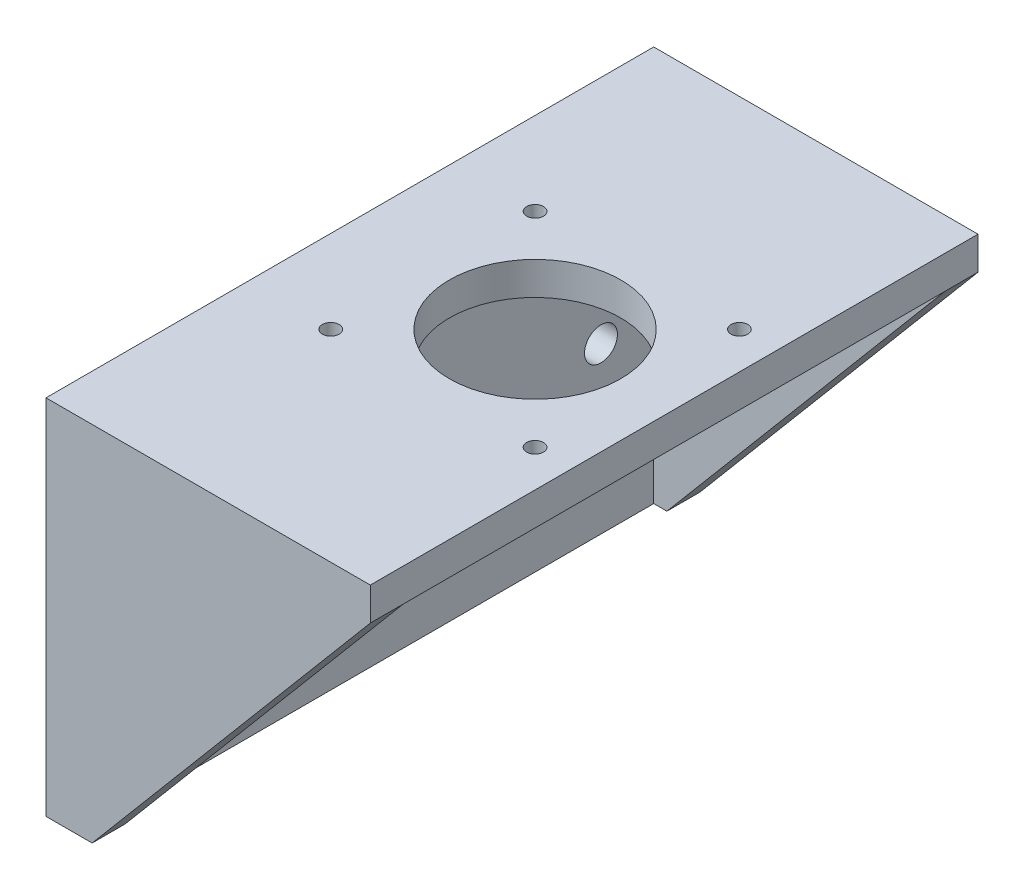
ISO-10303-21;
HEADER;
FILE_DESCRIPTION(('STEP AP214'),'2;1');
FILE_NAME('part.step','',(''),(''),'','','');
FILE_SCHEMA(('AUTOMOTIVE_DESIGN { 1 0 10303 214 1 1 1 1 }'));
ENDSEC;
DATA;
#1=APPLICATION_CONTEXT('core data for automotive mechanical design processes');
#2=APPLICATION_PROTOCOL_DEFINITION('international standard','automotive_design',2000,#1);
#3=PRODUCT_CONTEXT('',#1,'mechanical');
#4=PRODUCT('Part','Part','',(#3));
#5=PRODUCT_RELATED_PRODUCT_CATEGORY('part','',(#4));
#6=PRODUCT_DEFINITION_FORMATION('','',#4);
#7=PRODUCT_DEFINITION_CONTEXT('part definition',#1,'design');
#8=PRODUCT_DEFINITION('design','',#6,#7);
#9=PRODUCT_DEFINITION_SHAPE('','',#8);
#10=(LENGTH_UNIT() NAMED_UNIT(*) SI_UNIT(.MILLI.,.METRE.));
#11=(NAMED_UNIT(*) PLANE_ANGLE_UNIT() SI_UNIT($,.RADIAN.));
#12=(NAMED_UNIT(*) SI_UNIT($,.STERADIAN.) SOLID_ANGLE_UNIT());
#13=UNCERTAINTY_MEASURE_WITH_UNIT(LENGTH_MEASURE(1.E-05),#10,'distance_accuracy_value','');
#14=(GEOMETRIC_REPRESENTATION_CONTEXT(3) GLOBAL_UNCERTAINTY_ASSIGNED_CONTEXT((#13)) GLOBAL_UNIT_ASSIGNED_CONTEXT((#10,
#11,#12)) REPRESENTATION_CONTEXT('',''));
#15=CARTESIAN_POINT('',(0.,0.,0.));
#16=DIRECTION('',(0.,0.,1.));
#17=DIRECTION('',(1.,0.,0.));
#18=AXIS2_PLACEMENT_3D('',#15,#16,#17);
#19=CARTESIAN_POINT('',(-28.1,-25.0000000000001,-33.1000000000001));
#20=DIRECTION('',(1.,0.,0.));
#21=DIRECTION('',(0.,0.,-1.));
#22=AXIS2_PLACEMENT_3D('',#19,#20,#21);
#23=CYLINDRICAL_SURFACE('',#22,2.5);
#24=CARTESIAN_POINT('',(-28.1,-25.0000000000001,-33.1000000000001));
#25=DIRECTION('',(-1.,0.,0.));
#26=DIRECTION('',(0.,0.,1.));
#27=AXIS2_PLACEMENT_3D('',#24,#25,#26);
#28=CIRCLE('',#27,2.5);
#29=CARTESIAN_POINT('',(-28.1,-25.0000000000001,-30.6000000000001));
#30=VERTEX_POINT('',#29);
#31=EDGE_CURVE('E159',#30,#30,#28,.T.);
#32=ORIENTED_EDGE('',*,*,#31,.T.);
#33=EDGE_LOOP('',(#32));
#34=FACE_BOUND('',#33,.T.);
#35=CARTESIAN_POINT('',(-23.1,-25.0000000000001,-33.1000000000001));
#36=DIRECTION('',(1.,0.,0.));
#37=DIRECTION('',(0.,0.,-1.));
#38=AXIS2_PLACEMENT_3D('',#35,#36,#37);
#39=CIRCLE('',#38,2.5);
#40=CARTESIAN_POINT('',(-23.1,-25.0000000000001,-35.6000000000001));
#41=VERTEX_POINT('',#40);
#42=EDGE_CURVE('E143',#41,#41,#39,.T.);
#43=ORIENTED_EDGE('',*,*,#42,.T.);
#44=EDGE_LOOP('',(#43));
#45=FACE_BOUND('',#44,.T.);
#46=ADVANCED_FACE('F45',(#34,#45),#23,.F.);
#47=CARTESIAN_POINT('',(-28.1,-25.,33.1));
#48=DIRECTION('',(1.,0.,0.));
#49=DIRECTION('',(0.,0.,-1.));
#50=AXIS2_PLACEMENT_3D('',#47,#48,#49);
#51=CYLINDRICAL_SURFACE('',#50,2.5);
#52=CARTESIAN_POINT('',(-28.1,-25.,33.1));
#53=DIRECTION('',(1.,0.,0.));
#54=DIRECTION('',(0.,0.,-1.));
#55=AXIS2_PLACEMENT_3D('',#52,#53,#54);
#56=CIRCLE('',#55,2.5);
#57=CARTESIAN_POINT('',(-28.1,-25.,30.6));
#58=VERTEX_POINT('',#57);
#59=EDGE_CURVE('E162',#58,#58,#56,.T.);
#60=ORIENTED_EDGE('',*,*,#59,.F.);
#61=EDGE_LOOP('',(#60));
#62=FACE_BOUND('',#61,.T.);
#63=CARTESIAN_POINT('',(-23.1,-25.,33.1));
#64=DIRECTION('',(1.,0.,0.));
#65=DIRECTION('',(0.,0.,-1.));
#66=AXIS2_PLACEMENT_3D('',#63,#64,#65);
#67=CIRCLE('',#66,2.5);
#68=CARTESIAN_POINT('',(-23.1,-25.,30.6));
#69=VERTEX_POINT('',#68);
#70=EDGE_CURVE('E147',#69,#69,#67,.T.);
#71=ORIENTED_EDGE('',*,*,#70,.T.);
#72=EDGE_LOOP('',(#71));
#73=FACE_BOUND('',#72,.T.);
#74=ADVANCED_FACE('F299',(#62,#73),#51,.F.);
#75=CARTESIAN_POINT('',(-28.1,5.,0.));
#76=DIRECTION('',(1.,0.,0.));
#77=DIRECTION('',(0.,0.,-1.));
#78=AXIS2_PLACEMENT_3D('',#75,#76,#77);
#79=PLANE('',#78);
#80=DIRECTION('',(0.,-1.,0.));
#81=VECTOR('',#80,1.);
#82=CARTESIAN_POINT('',(-28.1,5.,-46.1));
#83=LINE('',#82,#81);
#84=CARTESIAN_POINT('',(-28.1,5.,-46.1));
#85=VERTEX_POINT('',#84);
#86=CARTESIAN_POINT('',(-28.1,-50.,-46.1));
#87=VERTEX_POINT('',#86);
#88=EDGE_CURVE('E261',#85,#87,#83,.T.);
#89=ORIENTED_EDGE('',*,*,#88,.T.);
#90=DIRECTION('',(0.,0.,1.));
#91=VECTOR('',#90,1.);
#92=CARTESIAN_POINT('',(-28.1,-50.,0.));
#93=LINE('',#92,#91);
#94=CARTESIAN_POINT('',(-28.1,-50.,46.1));
#95=VERTEX_POINT('',#94);
#96=EDGE_CURVE('E191',#87,#95,#93,.T.);
#97=ORIENTED_EDGE('',*,*,#96,.T.);
#98=DIRECTION('',(0.,-1.,0.));
#99=VECTOR('',#98,1.);
#100=CARTESIAN_POINT('',(-28.1,5.,46.1));
#101=LINE('',#100,#99);
#102=CARTESIAN_POINT('',(-28.1,5.,46.1));
#103=VERTEX_POINT('',#102);
#104=EDGE_CURVE('E236',#103,#95,#101,.T.);
#105=ORIENTED_EDGE('',*,*,#104,.F.);
#106=DIRECTION('',(0.,0.,1.));
#107=VECTOR('',#106,1.);
#108=CARTESIAN_POINT('',(-28.1,5.,0.));
#109=LINE('',#108,#107);
#110=EDGE_CURVE('E213',#85,#103,#109,.T.);
#111=ORIENTED_EDGE('',*,*,#110,.F.);
#112=EDGE_LOOP('',(#89,#97,#105,#111));
#113=FACE_BOUND('',#112,.T.);
#114=ORIENTED_EDGE('',*,*,#31,.F.);
#115=EDGE_LOOP('',(#114));
#116=FACE_BOUND('',#115,.T.);
#117=ORIENTED_EDGE('',*,*,#59,.T.);
#118=EDGE_LOOP('',(#117));
#119=FACE_BOUND('',#118,.T.);
#120=ADVANCED_FACE('F296',(#113,#116,#119),#79,.F.);
#121=CARTESIAN_POINT('',(0.,0.,0.));
#122=DIRECTION('',(0.,1.,0.));
#123=DIRECTION('',(0.,0.,1.));
#124=AXIS2_PLACEMENT_3D('',#121,#122,#123);
#125=PLANE('',#124);
#126=CARTESIAN_POINT('',(15.5,0.,15.5));
#127=DIRECTION('',(0.,1.,0.));
#128=DIRECTION('',(0.,0.,1.));
#129=AXIS2_PLACEMENT_3D('',#126,#127,#128);
#130=CIRCLE('',#129,1.275);
#131=CARTESIAN_POINT('',(15.5,0.,16.775));
#132=VERTEX_POINT('',#131);
#133=EDGE_CURVE('E206',#132,#132,#130,.T.);
#134=ORIENTED_EDGE('',*,*,#133,.T.);
#135=EDGE_LOOP('',(#134));
#136=FACE_BOUND('',#135,.T.);
#137=CARTESIAN_POINT('',(-15.5,0.,15.5));
#138=DIRECTION('',(0.,1.,0.));
#139=DIRECTION('',(0.,0.,1.));
#140=AXIS2_PLACEMENT_3D('',#137,#138,#139);
#141=CIRCLE('',#140,1.275);
#142=CARTESIAN_POINT('',(-15.5,0.,16.775));
#143=VERTEX_POINT('',#142);
#144=EDGE_CURVE('E251',#143,#143,#141,.T.);
#145=ORIENTED_EDGE('',*,*,#144,.T.);
#146=EDGE_LOOP('',(#145));
#147=FACE_BOUND('',#146,.T.);
#148=CARTESIAN_POINT('',(15.5,0.,-15.5));
#149=DIRECTION('',(0.,1.,0.));
#150=DIRECTION('',(0.,0.,1.));
#151=AXIS2_PLACEMENT_3D('',#148,#149,#150);
#152=CIRCLE('',#151,1.275);
#153=CARTESIAN_POINT('',(15.5,0.,-14.225));
#154=VERTEX_POINT('',#153);
#155=EDGE_CURVE('E247',#154,#154,#152,.T.);
#156=ORIENTED_EDGE('',*,*,#155,.T.);
#157=EDGE_LOOP('',(#156));
#158=FACE_BOUND('',#157,.T.);
#159=CARTESIAN_POINT('',(-15.5,0.,-15.5));
#160=DIRECTION('',(0.,1.,0.));
#161=DIRECTION('',(0.,0.,1.));
#162=AXIS2_PLACEMENT_3D('',#159,#160,#161);
#163=CIRCLE('',#162,1.275);
#164=CARTESIAN_POINT('',(-15.5,0.,-14.225));
#165=VERTEX_POINT('',#164);
#166=EDGE_CURVE('E243',#165,#165,#163,.T.);
#167=ORIENTED_EDGE('',*,*,#166,.T.);
#168=EDGE_LOOP('',(#167));
#169=FACE_BOUND('',#168,.T.);
#170=CARTESIAN_POINT('',(0.,0.,0.));
#171=DIRECTION('',(0.,1.,0.));
#172=DIRECTION('',(0.,0.,1.));
#173=AXIS2_PLACEMENT_3D('',#170,#171,#172);
#174=CIRCLE('',#173,13.);
#175=CARTESIAN_POINT('',(0.,0.,13.));
#176=VERTEX_POINT('',#175);
#177=EDGE_CURVE('E239',#176,#176,#174,.T.);
#178=ORIENTED_EDGE('',*,*,#177,.T.);
#179=EDGE_LOOP('',(#178));
#180=FACE_BOUND('',#179,.T.);
#181=DIRECTION('',(1.,0.,0.));
#182=VECTOR('',#181,1.);
#183=CARTESIAN_POINT('',(0.,0.,41.1));
#184=LINE('',#183,#182);
#185=CARTESIAN_POINT('',(-23.1,0.,41.1));
#186=VERTEX_POINT('',#185);
#187=CARTESIAN_POINT('',(21.1,0.,41.1));
#188=VERTEX_POINT('',#187);
#189=EDGE_CURVE('E131',#186,#188,#184,.T.);
#190=ORIENTED_EDGE('',*,*,#189,.F.);
#191=DIRECTION('',(0.,0.,1.));
#192=VECTOR('',#191,1.);
#193=CARTESIAN_POINT('',(-23.1,0.,-41.1));
#194=LINE('',#193,#192);
#195=CARTESIAN_POINT('',(-23.1,0.,-41.1));
#196=VERTEX_POINT('',#195);
#197=EDGE_CURVE('E133',#196,#186,#194,.T.);
#198=ORIENTED_EDGE('',*,*,#197,.F.);
#199=DIRECTION('',(1.,0.,0.));
#200=VECTOR('',#199,1.);
#201=CARTESIAN_POINT('',(0.,0.,-41.1));
#202=LINE('',#201,#200);
#203=CARTESIAN_POINT('',(21.1,0.,-41.1));
#204=VERTEX_POINT('',#203);
#205=EDGE_CURVE('E119',#196,#204,#202,.T.);
#206=ORIENTED_EDGE('',*,*,#205,.T.);
#207=DIRECTION('',(0.,0.,-1.));
#208=VECTOR('',#207,1.);
#209=CARTESIAN_POINT('',(21.1,0.,0.));
#210=LINE('',#209,#208);
#211=EDGE_CURVE('E198',#188,#204,#210,.T.);
#212=ORIENTED_EDGE('',*,*,#211,.F.);
#213=EDGE_LOOP('',(#190,#198,#206,#212));
#214=FACE_BOUND('',#213,.T.);
#215=ADVANCED_FACE('F134',(#136,#147,#158,#169,#180,#214),#125,.F.);
#216=CARTESIAN_POINT('',(0.,5.,46.1));
#217=DIRECTION('',(0.,0.,1.));
#218=DIRECTION('',(1.,0.,0.));
#219=AXIS2_PLACEMENT_3D('',#216,#217,#218);
#220=PLANE('',#219);
#221=DIRECTION('',(-0.644982532170896,-0.764197312998691,0.));
#222=VECTOR('',#221,1.);
#223=CARTESIAN_POINT('',(12.3223479504023,-10.4000616701395,46.1));
#224=LINE('',#223,#222);
#225=CARTESIAN_POINT('',(21.1,0.,46.1));
#226=VERTEX_POINT('',#225);
#227=CARTESIAN_POINT('',(-21.1,-50.,46.1));
#228=VERTEX_POINT('',#227);
#229=EDGE_CURVE('E69',#226,#228,#224,.T.);
#230=ORIENTED_EDGE('',*,*,#229,.F.);
#231=DIRECTION('',(0.,-1.,0.));
#232=VECTOR('',#231,1.);
#233=CARTESIAN_POINT('',(21.1,5.,46.1));
#234=LINE('',#233,#232);
#235=CARTESIAN_POINT('',(21.1,5.,46.1));
#236=VERTEX_POINT('',#235);
#237=EDGE_CURVE('E54',#236,#226,#234,.T.);
#238=ORIENTED_EDGE('',*,*,#237,.F.);
#239=DIRECTION('',(-1.,0.,0.));
#240=VECTOR('',#239,1.);
#241=CARTESIAN_POINT('',(0.,5.,46.1));
#242=LINE('',#241,#240);
#243=EDGE_CURVE('E201',#236,#103,#242,.T.);
#244=ORIENTED_EDGE('',*,*,#243,.T.);
#245=ORIENTED_EDGE('',*,*,#104,.T.);
#246=DIRECTION('',(-1.,0.,0.));
#247=VECTOR('',#246,1.);
#248=CARTESIAN_POINT('',(0.,-50.,46.1));
#249=LINE('',#248,#247);
#250=EDGE_CURVE('E195',#228,#95,#249,.T.);
#251=ORIENTED_EDGE('',*,*,#250,.F.);
#252=EDGE_LOOP('',(#230,#238,#244,#245,#251));
#253=FACE_BOUND('',#252,.T.);
#254=ADVANCED_FACE('F47',(#253),#220,.T.);
#255=CARTESIAN_POINT('',(21.1,5.,0.));
#256=DIRECTION('',(-1.,0.,0.));
#257=DIRECTION('',(0.,0.,1.));
#258=AXIS2_PLACEMENT_3D('',#255,#256,#257);
#259=PLANE('',#258);
#260=ORIENTED_EDGE('',*,*,#237,.T.);
#261=DIRECTION('',(0.,0.,1.));
#262=VECTOR('',#261,1.);
#263=CARTESIAN_POINT('',(21.1,0.,-46.1));
#264=LINE('',#263,#262);
#265=EDGE_CURVE('E173',#188,#226,#264,.T.);
#266=ORIENTED_EDGE('',*,*,#265,.F.);
#267=ORIENTED_EDGE('',*,*,#211,.T.);
#268=CARTESIAN_POINT('',(21.1,0.,-46.1));
#269=VERTEX_POINT('',#268);
#270=EDGE_CURVE('E181',#269,#204,#264,.T.);
#271=ORIENTED_EDGE('',*,*,#270,.F.);
#272=DIRECTION('',(0.,-1.,0.));
#273=VECTOR('',#272,1.);
#274=CARTESIAN_POINT('',(21.1,5.,-46.1));
#275=LINE('',#274,#273);
#276=CARTESIAN_POINT('',(21.1,5.,-46.1));
#277=VERTEX_POINT('',#276);
#278=EDGE_CURVE('E265',#277,#269,#275,.T.);
#279=ORIENTED_EDGE('',*,*,#278,.F.);
#280=DIRECTION('',(0.,0.,-1.));
#281=VECTOR('',#280,1.);
#282=CARTESIAN_POINT('',(21.1,5.,0.));
#283=LINE('',#282,#281);
#284=EDGE_CURVE('E205',#236,#277,#283,.T.);
#285=ORIENTED_EDGE('',*,*,#284,.F.);
#286=EDGE_LOOP('',(#260,#266,#267,#271,#279,#285));
#287=FACE_BOUND('',#286,.T.);
#288=ADVANCED_FACE('F273',(#287),#259,.F.);
#289=CARTESIAN_POINT('',(0.,5.,-46.1));
#290=DIRECTION('',(0.,0.,-1.));
#291=DIRECTION('',(-1.,0.,0.));
#292=AXIS2_PLACEMENT_3D('',#289,#290,#291);
#293=PLANE('',#292);
#294=DIRECTION('',(-0.644982532170896,-0.764197312998691,0.));
#295=VECTOR('',#294,1.);
#296=CARTESIAN_POINT('',(12.3223479504023,-10.4000616701395,-46.1));
#297=LINE('',#296,#295);
#298=CARTESIAN_POINT('',(-21.1,-50.,-46.1));
#299=VERTEX_POINT('',#298);
#300=EDGE_CURVE('E169',#269,#299,#297,.T.);
#301=ORIENTED_EDGE('',*,*,#300,.T.);
#302=DIRECTION('',(-1.,0.,0.));
#303=VECTOR('',#302,1.);
#304=CARTESIAN_POINT('',(0.,-50.,-46.1));
#305=LINE('',#304,#303);
#306=EDGE_CURVE('E130',#299,#87,#305,.T.);
#307=ORIENTED_EDGE('',*,*,#306,.T.);
#308=ORIENTED_EDGE('',*,*,#88,.F.);
#309=DIRECTION('',(1.,0.,0.));
#310=VECTOR('',#309,1.);
#311=CARTESIAN_POINT('',(0.,5.,-46.1));
#312=LINE('',#311,#310);
#313=EDGE_CURVE('E209',#85,#277,#312,.T.);
#314=ORIENTED_EDGE('',*,*,#313,.T.);
#315=ORIENTED_EDGE('',*,*,#278,.T.);
#316=EDGE_LOOP('',(#301,#307,#308,#314,#315));
#317=FACE_BOUND('',#316,.T.);
#318=ADVANCED_FACE('F289',(#317),#293,.T.);
#319=CARTESIAN_POINT('',(-15.5,5.,15.5));
#320=DIRECTION('',(0.,-1.,0.));
#321=DIRECTION('',(0.,0.,-1.));
#322=AXIS2_PLACEMENT_3D('',#319,#320,#321);
#323=CYLINDRICAL_SURFACE('',#322,1.275);
#324=CARTESIAN_POINT('',(-15.5,5.,15.5));
#325=DIRECTION('',(0.,1.,0.));
#326=DIRECTION('',(0.,0.,1.));
#327=AXIS2_PLACEMENT_3D('',#324,#325,#326);
#328=CIRCLE('',#327,1.275);
#329=CARTESIAN_POINT('',(-15.5,5.,16.775));
#330=VERTEX_POINT('',#329);
#331=EDGE_CURVE('E228',#330,#330,#328,.T.);
#332=ORIENTED_EDGE('',*,*,#331,.T.);
#333=EDGE_LOOP('',(#332));
#334=FACE_BOUND('',#333,.T.);
#335=ORIENTED_EDGE('',*,*,#144,.F.);
#336=EDGE_LOOP('',(#335));
#337=FACE_BOUND('',#336,.T.);
#338=ADVANCED_FACE('F342',(#334,#337),#323,.F.);
#339=CARTESIAN_POINT('',(15.5,5.,-15.5));
#340=DIRECTION('',(0.,-1.,0.));
#341=DIRECTION('',(0.,0.,-1.));
#342=AXIS2_PLACEMENT_3D('',#339,#340,#341);
#343=CYLINDRICAL_SURFACE('',#342,1.275);
#344=CARTESIAN_POINT('',(15.5,5.,-15.5));
#345=DIRECTION('',(0.,1.,0.));
#346=DIRECTION('',(0.,0.,1.));
#347=AXIS2_PLACEMENT_3D('',#344,#345,#346);
#348=CIRCLE('',#347,1.275);
#349=CARTESIAN_POINT('',(15.5,5.,-14.225));
#350=VERTEX_POINT('',#349);
#351=EDGE_CURVE('E224',#350,#350,#348,.T.);
#352=ORIENTED_EDGE('',*,*,#351,.T.);
#353=EDGE_LOOP('',(#352));
#354=FACE_BOUND('',#353,.T.);
#355=ORIENTED_EDGE('',*,*,#155,.F.);
#356=EDGE_LOOP('',(#355));
#357=FACE_BOUND('',#356,.T.);
#358=ADVANCED_FACE('F345',(#354,#357),#343,.F.);
#359=CARTESIAN_POINT('',(-15.5,5.,-15.5));
#360=DIRECTION('',(0.,-1.,0.));
#361=DIRECTION('',(0.,0.,-1.));
#362=AXIS2_PLACEMENT_3D('',#359,#360,#361);
#363=CYLINDRICAL_SURFACE('',#362,1.275);
#364=CARTESIAN_POINT('',(-15.5,5.,-15.5));
#365=DIRECTION('',(0.,1.,0.));
#366=DIRECTION('',(0.,0.,1.));
#367=AXIS2_PLACEMENT_3D('',#364,#365,#366);
#368=CIRCLE('',#367,1.275);
#369=CARTESIAN_POINT('',(-15.5,5.,-14.225));
#370=VERTEX_POINT('',#369);
#371=EDGE_CURVE('E220',#370,#370,#368,.T.);
#372=ORIENTED_EDGE('',*,*,#371,.T.);
#373=EDGE_LOOP('',(#372));
#374=FACE_BOUND('',#373,.T.);
#375=ORIENTED_EDGE('',*,*,#166,.F.);
#376=EDGE_LOOP('',(#375));
#377=FACE_BOUND('',#376,.T.);
#378=ADVANCED_FACE('F349',(#374,#377),#363,.F.);
#379=CARTESIAN_POINT('',(0.,5.,0.));
#380=DIRECTION('',(0.,-1.,0.));
#381=DIRECTION('',(0.,0.,-1.));
#382=AXIS2_PLACEMENT_3D('',#379,#380,#381);
#383=CYLINDRICAL_SURFACE('',#382,13.);
#384=CARTESIAN_POINT('',(0.,5.,0.));
#385=DIRECTION('',(0.,1.,0.));
#386=DIRECTION('',(0.,0.,1.));
#387=AXIS2_PLACEMENT_3D('',#384,#385,#386);
#388=CIRCLE('',#387,13.);
#389=CARTESIAN_POINT('',(0.,5.,13.));
#390=VERTEX_POINT('',#389);
#391=EDGE_CURVE('E216',#390,#390,#388,.T.);
#392=ORIENTED_EDGE('',*,*,#391,.T.);
#393=EDGE_LOOP('',(#392));
#394=FACE_BOUND('',#393,.T.);
#395=ORIENTED_EDGE('',*,*,#177,.F.);
#396=EDGE_LOOP('',(#395));
#397=FACE_BOUND('',#396,.T.);
#398=ADVANCED_FACE('F340',(#394,#397),#383,.F.);
#399=CARTESIAN_POINT('',(15.5,5.,15.5));
#400=DIRECTION('',(0.,-1.,0.));
#401=DIRECTION('',(0.,0.,-1.));
#402=AXIS2_PLACEMENT_3D('',#399,#400,#401);
#403=CYLINDRICAL_SURFACE('',#402,1.275);
#404=CARTESIAN_POINT('',(15.5,5.,15.5));
#405=DIRECTION('',(0.,1.,0.));
#406=DIRECTION('',(0.,0.,1.));
#407=AXIS2_PLACEMENT_3D('',#404,#405,#406);
#408=CIRCLE('',#407,1.275);
#409=CARTESIAN_POINT('',(15.5,5.,16.775));
#410=VERTEX_POINT('',#409);
#411=EDGE_CURVE('E232',#410,#410,#408,.T.);
#412=ORIENTED_EDGE('',*,*,#411,.T.);
#413=EDGE_LOOP('',(#412));
#414=FACE_BOUND('',#413,.T.);
#415=ORIENTED_EDGE('',*,*,#133,.F.);
#416=EDGE_LOOP('',(#415));
#417=FACE_BOUND('',#416,.T.);
#418=ADVANCED_FACE('F334',(#414,#417),#403,.F.);
#419=CARTESIAN_POINT('',(0.,5.,0.));
#420=DIRECTION('',(0.,1.,0.));
#421=DIRECTION('',(0.,0.,1.));
#422=AXIS2_PLACEMENT_3D('',#419,#420,#421);
#423=PLANE('',#422);
#424=ORIENTED_EDGE('',*,*,#243,.F.);
#425=ORIENTED_EDGE('',*,*,#284,.T.);
#426=ORIENTED_EDGE('',*,*,#313,.F.);
#427=ORIENTED_EDGE('',*,*,#110,.T.);
#428=EDGE_LOOP('',(#424,#425,#426,#427));
#429=FACE_BOUND('',#428,.T.);
#430=ORIENTED_EDGE('',*,*,#391,.F.);
#431=EDGE_LOOP('',(#430));
#432=FACE_BOUND('',#431,.T.);
#433=ORIENTED_EDGE('',*,*,#371,.F.);
#434=EDGE_LOOP('',(#433));
#435=FACE_BOUND('',#434,.T.);
#436=ORIENTED_EDGE('',*,*,#351,.F.);
#437=EDGE_LOOP('',(#436));
#438=FACE_BOUND('',#437,.T.);
#439=ORIENTED_EDGE('',*,*,#331,.F.);
#440=EDGE_LOOP('',(#439));
#441=FACE_BOUND('',#440,.T.);
#442=ORIENTED_EDGE('',*,*,#411,.F.);
#443=EDGE_LOOP('',(#442));
#444=FACE_BOUND('',#443,.T.);
#445=ADVANCED_FACE('F293',(#429,#432,#435,#438,#441,#444),#423,.T.);
#446=CARTESIAN_POINT('',(0.,-50.,-41.1));
#447=DIRECTION('',(0.,0.,1.));
#448=DIRECTION('',(1.,0.,0.));
#449=AXIS2_PLACEMENT_3D('',#446,#447,#448);
#450=PLANE('',#449);
#451=DIRECTION('',(-0.644982532170896,-0.764197312998691,0.));
#452=VECTOR('',#451,1.);
#453=CARTESIAN_POINT('',(-12.3223479504022,-39.5999383298605,-41.1));
#454=LINE('',#453,#452);
#455=CARTESIAN_POINT('',(-21.1,-50.,-41.1));
#456=VERTEX_POINT('',#455);
#457=EDGE_CURVE('E125',#204,#456,#454,.T.);
#458=ORIENTED_EDGE('',*,*,#457,.F.);
#459=ORIENTED_EDGE('',*,*,#205,.F.);
#460=DIRECTION('',(0.,1.,0.));
#461=VECTOR('',#460,1.);
#462=CARTESIAN_POINT('',(-23.1,-50.,-41.1));
#463=LINE('',#462,#461);
#464=CARTESIAN_POINT('',(-23.1,-50.,-41.1));
#465=VERTEX_POINT('',#464);
#466=EDGE_CURVE('E123',#465,#196,#463,.T.);
#467=ORIENTED_EDGE('',*,*,#466,.F.);
#468=DIRECTION('',(1.,0.,0.));
#469=VECTOR('',#468,1.);
#470=CARTESIAN_POINT('',(-23.1,-50.,-41.1));
#471=LINE('',#470,#469);
#472=EDGE_CURVE('E156',#465,#456,#471,.T.);
#473=ORIENTED_EDGE('',*,*,#472,.T.);
#474=EDGE_LOOP('',(#458,#459,#467,#473));
#475=FACE_BOUND('',#474,.T.);
#476=ADVANCED_FACE('F121',(#475),#450,.T.);
#477=CARTESIAN_POINT('',(0.,-50.,41.1));
#478=DIRECTION('',(0.,0.,1.));
#479=DIRECTION('',(1.,0.,0.));
#480=AXIS2_PLACEMENT_3D('',#477,#478,#479);
#481=PLANE('',#480);
#482=ORIENTED_EDGE('',*,*,#189,.T.);
#483=DIRECTION('',(-0.644982532170896,-0.764197312998691,0.));
#484=VECTOR('',#483,1.);
#485=CARTESIAN_POINT('',(-12.3223479504022,-39.5999383298605,41.1));
#486=LINE('',#485,#484);
#487=CARTESIAN_POINT('',(-21.1,-50.,41.1));
#488=VERTEX_POINT('',#487);
#489=EDGE_CURVE('E180',#188,#488,#486,.T.);
#490=ORIENTED_EDGE('',*,*,#489,.T.);
#491=DIRECTION('',(1.,0.,0.));
#492=VECTOR('',#491,1.);
#493=CARTESIAN_POINT('',(-23.1,-50.,41.1));
#494=LINE('',#493,#492);
#495=CARTESIAN_POINT('',(-23.1,-50.,41.1));
#496=VERTEX_POINT('',#495);
#497=EDGE_CURVE('E155',#496,#488,#494,.T.);
#498=ORIENTED_EDGE('',*,*,#497,.F.);
#499=DIRECTION('',(0.,-1.,0.));
#500=VECTOR('',#499,1.);
#501=CARTESIAN_POINT('',(-23.1,0.,41.1));
#502=LINE('',#501,#500);
#503=EDGE_CURVE('E61',#186,#496,#502,.T.);
#504=ORIENTED_EDGE('',*,*,#503,.F.);
#505=EDGE_LOOP('',(#482,#490,#498,#504));
#506=FACE_BOUND('',#505,.T.);
#507=ADVANCED_FACE('F285',(#506),#481,.F.);
#508=CARTESIAN_POINT('',(0.,-50.,0.));
#509=DIRECTION('',(0.,1.,0.));
#510=DIRECTION('',(0.,0.,1.));
#511=AXIS2_PLACEMENT_3D('',#508,#509,#510);
#512=PLANE('',#511);
#513=DIRECTION('',(0.,0.,1.));
#514=VECTOR('',#513,1.);
#515=CARTESIAN_POINT('',(-21.1,-50.,-46.1));
#516=LINE('',#515,#514);
#517=EDGE_CURVE('E176',#299,#456,#516,.T.);
#518=ORIENTED_EDGE('',*,*,#517,.T.);
#519=ORIENTED_EDGE('',*,*,#472,.F.);
#520=DIRECTION('',(0.,0.,-1.));
#521=VECTOR('',#520,1.);
#522=CARTESIAN_POINT('',(-23.1,-50.,41.1));
#523=LINE('',#522,#521);
#524=EDGE_CURVE('E140',#496,#465,#523,.T.);
#525=ORIENTED_EDGE('',*,*,#524,.F.);
#526=ORIENTED_EDGE('',*,*,#497,.T.);
#527=DIRECTION('',(0.,0.,1.));
#528=VECTOR('',#527,1.);
#529=CARTESIAN_POINT('',(-21.1,-50.,0.));
#530=LINE('',#529,#528);
#531=EDGE_CURVE('E11',#488,#228,#530,.T.);
#532=ORIENTED_EDGE('',*,*,#531,.T.);
#533=ORIENTED_EDGE('',*,*,#250,.T.);
#534=ORIENTED_EDGE('',*,*,#96,.F.);
#535=ORIENTED_EDGE('',*,*,#306,.F.);
#536=EDGE_LOOP('',(#518,#519,#525,#526,#532,#533,#534,#535));
#537=FACE_BOUND('',#536,.T.);
#538=ADVANCED_FACE('F281',(#537),#512,.F.);
#539=CARTESIAN_POINT('',(12.3223479504023,-10.4000616701395,-46.1));
#540=DIRECTION('',(-0.764197312998691,0.644982532170896,0.));
#541=DIRECTION('',(-0.644982532170896,-0.764197312998691,0.));
#542=AXIS2_PLACEMENT_3D('',#539,#540,#541);
#543=PLANE('',#542);
#544=ORIENTED_EDGE('',*,*,#265,.T.);
#545=ORIENTED_EDGE('',*,*,#229,.T.);
#546=ORIENTED_EDGE('',*,*,#531,.F.);
#547=ORIENTED_EDGE('',*,*,#489,.F.);
#548=EDGE_LOOP('',(#544,#545,#546,#547));
#549=FACE_BOUND('',#548,.T.);
#550=ADVANCED_FACE('F283',(#549),#543,.F.);
#551=ORIENTED_EDGE('',*,*,#457,.T.);
#552=ORIENTED_EDGE('',*,*,#517,.F.);
#553=ORIENTED_EDGE('',*,*,#300,.F.);
#554=ORIENTED_EDGE('',*,*,#270,.T.);
#555=EDGE_LOOP('',(#551,#552,#553,#554));
#556=FACE_BOUND('',#555,.T.);
#557=ADVANCED_FACE('F314',(#556),#543,.F.);
#558=CARTESIAN_POINT('',(-23.1,0.,0.));
#559=DIRECTION('',(1.,0.,0.));
#560=DIRECTION('',(0.,0.,-1.));
#561=AXIS2_PLACEMENT_3D('',#558,#559,#560);
#562=PLANE('',#561);
#563=ORIENTED_EDGE('',*,*,#70,.F.);
#564=EDGE_LOOP('',(#563));
#565=FACE_BOUND('',#564,.T.);
#566=ORIENTED_EDGE('',*,*,#42,.F.);
#567=EDGE_LOOP('',(#566));
#568=FACE_BOUND('',#567,.T.);
#569=ORIENTED_EDGE('',*,*,#466,.T.);
#570=ORIENTED_EDGE('',*,*,#197,.T.);
#571=ORIENTED_EDGE('',*,*,#503,.T.);
#572=ORIENTED_EDGE('',*,*,#524,.T.);
#573=EDGE_LOOP('',(#569,#570,#571,#572));
#574=FACE_BOUND('',#573,.T.);
#575=ADVANCED_FACE('F138',(#565,#568,#574),#562,.T.);
#576=CLOSED_SHELL('',(#46,#74,#120,#215,#254,#288,#318,#338,#358,#378,#398,#418,#445,#476,#507,
#538,#550,#557,#575));
#577=MANIFOLD_SOLID_BREP('B2',#576);
#578=ADVANCED_BREP_SHAPE_REPRESENTATION('',(#18,#577),#14);
#579=SHAPE_DEFINITION_REPRESENTATION(#9,#578);
ENDSEC;
END-ISO-10303-21;
